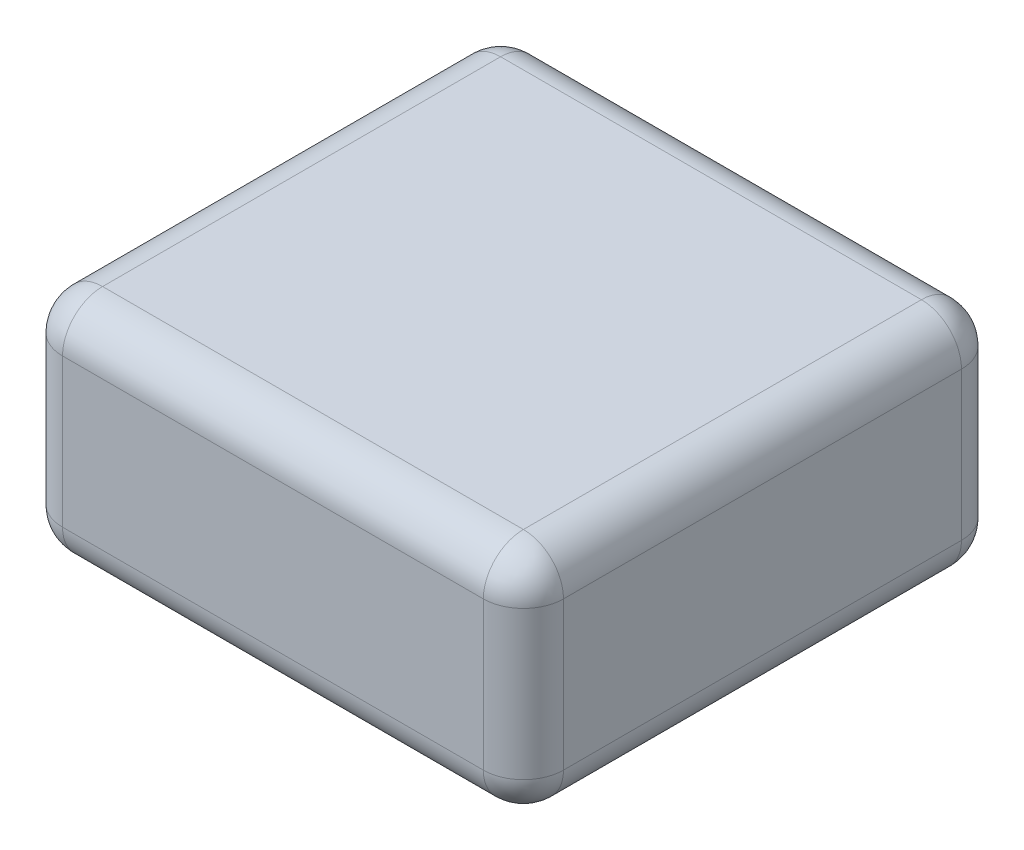
ISO-10303-21;
HEADER;
FILE_DESCRIPTION(('STEP AP214'),'2;1');
FILE_NAME('part.step','',(''),(''),'','','');
FILE_SCHEMA(('AUTOMOTIVE_DESIGN { 1 0 10303 214 1 1 1 1 }'));
ENDSEC;
DATA;
#1=APPLICATION_CONTEXT('core data for automotive mechanical design processes');
#2=APPLICATION_PROTOCOL_DEFINITION('international standard','automotive_design',2000,#1);
#3=PRODUCT_CONTEXT('',#1,'mechanical');
#4=PRODUCT('Part','Part','',(#3));
#5=PRODUCT_RELATED_PRODUCT_CATEGORY('part','',(#4));
#6=PRODUCT_DEFINITION_FORMATION('','',#4);
#7=PRODUCT_DEFINITION_CONTEXT('part definition',#1,'design');
#8=PRODUCT_DEFINITION('design','',#6,#7);
#9=PRODUCT_DEFINITION_SHAPE('','',#8);
#10=(LENGTH_UNIT() NAMED_UNIT(*) SI_UNIT(.MILLI.,.METRE.));
#11=(NAMED_UNIT(*) PLANE_ANGLE_UNIT() SI_UNIT($,.RADIAN.));
#12=(NAMED_UNIT(*) SI_UNIT($,.STERADIAN.) SOLID_ANGLE_UNIT());
#13=UNCERTAINTY_MEASURE_WITH_UNIT(LENGTH_MEASURE(1.E-05),#10,'distance_accuracy_value','');
#14=(GEOMETRIC_REPRESENTATION_CONTEXT(3) GLOBAL_UNCERTAINTY_ASSIGNED_CONTEXT((#13)) GLOBAL_UNIT_ASSIGNED_CONTEXT((#10,
#11,#12)) REPRESENTATION_CONTEXT('',''));
#15=CARTESIAN_POINT('',(0.,0.,0.));
#16=DIRECTION('',(0.,0.,1.));
#17=DIRECTION('',(1.,0.,0.));
#18=AXIS2_PLACEMENT_3D('',#15,#16,#17);
#19=CARTESIAN_POINT('',(10.5,-36.3,100.931));
#20=DIRECTION('',(0.,-1.,0.));
#21=DIRECTION('',(1.,0.,0.));
#22=AXIS2_PLACEMENT_3D('',#19,#20,#21);
#23=SPHERICAL_SURFACE('',#22,2.);
#24=CARTESIAN_POINT('',(10.5,-36.3,100.931));
#25=DIRECTION('',(0.,0.,-1.));
#26=DIRECTION('',(1.,0.,0.));
#27=AXIS2_PLACEMENT_3D('',#24,#25,#26);
#28=CIRCLE('',#27,2.);
#29=CARTESIAN_POINT('',(10.5,-34.3,100.931));
#30=VERTEX_POINT('',#29);
#31=CARTESIAN_POINT('',(12.5,-36.3,100.931));
#32=VERTEX_POINT('',#31);
#33=EDGE_CURVE('E10',#30,#32,#28,.T.);
#34=ORIENTED_EDGE('',*,*,#33,.F.);
#35=CARTESIAN_POINT('',(10.5,-36.3,100.931));
#36=DIRECTION('',(1.,0.,0.));
#37=DIRECTION('',(0.,0.,1.));
#38=AXIS2_PLACEMENT_3D('',#35,#36,#37);
#39=CIRCLE('',#38,2.);
#40=CARTESIAN_POINT('',(10.5,-36.3,102.931));
#41=VERTEX_POINT('',#40);
#42=EDGE_CURVE('E129',#30,#41,#39,.T.);
#43=ORIENTED_EDGE('',*,*,#42,.T.);
#44=CARTESIAN_POINT('',(10.5,-36.3,100.931));
#45=DIRECTION('',(0.,-1.,0.));
#46=DIRECTION('',(1.,0.,0.));
#47=AXIS2_PLACEMENT_3D('',#44,#45,#46);
#48=CIRCLE('',#47,2.);
#49=EDGE_CURVE('E118',#32,#41,#48,.T.);
#50=ORIENTED_EDGE('',*,*,#49,.F.);
#51=EDGE_LOOP('',(#34,#43,#50));
#52=FACE_BOUND('',#51,.T.);
#53=ADVANCED_FACE('F16',(#52),#23,.T.);
#54=CARTESIAN_POINT('',(10.5,-36.3,81.069));
#55=DIRECTION('',(0.,0.,1.));
#56=DIRECTION('',(1.,0.,0.));
#57=AXIS2_PLACEMENT_3D('',#54,#55,#56);
#58=SPHERICAL_SURFACE('',#57,2.);
#59=CARTESIAN_POINT('',(10.5,-36.3,81.069));
#60=DIRECTION('',(0.,-1.,0.));
#61=DIRECTION('',(1.,0.,0.));
#62=AXIS2_PLACEMENT_3D('',#59,#60,#61);
#63=CIRCLE('',#62,2.);
#64=CARTESIAN_POINT('',(10.5,-36.3,79.069));
#65=VERTEX_POINT('',#64);
#66=CARTESIAN_POINT('',(12.5,-36.3,81.069));
#67=VERTEX_POINT('',#66);
#68=EDGE_CURVE('E200',#65,#67,#63,.T.);
#69=ORIENTED_EDGE('',*,*,#68,.F.);
#70=CARTESIAN_POINT('',(10.5,-36.3,81.069));
#71=DIRECTION('',(1.,0.,0.));
#72=DIRECTION('',(0.,1.,0.));
#73=AXIS2_PLACEMENT_3D('',#70,#71,#72);
#74=CIRCLE('',#73,2.);
#75=CARTESIAN_POINT('',(10.5,-34.3,81.069));
#76=VERTEX_POINT('',#75);
#77=EDGE_CURVE('E137',#65,#76,#74,.T.);
#78=ORIENTED_EDGE('',*,*,#77,.T.);
#79=CARTESIAN_POINT('',(10.5,-36.3,81.069));
#80=DIRECTION('',(0.,0.,1.));
#81=DIRECTION('',(1.,0.,0.));
#82=AXIS2_PLACEMENT_3D('',#79,#80,#81);
#83=CIRCLE('',#82,2.);
#84=EDGE_CURVE('E24',#67,#76,#83,.T.);
#85=ORIENTED_EDGE('',*,*,#84,.F.);
#86=EDGE_LOOP('',(#69,#78,#85));
#87=FACE_BOUND('',#86,.T.);
#88=ADVANCED_FACE('F217',(#87),#58,.T.);
#89=CARTESIAN_POINT('',(12.5,-45.7,79.069));
#90=DIRECTION('',(1.,0.,0.));
#91=DIRECTION('',(0.,1.,0.));
#92=AXIS2_PLACEMENT_3D('',#89,#90,#91);
#93=PLANE('',#92);
#94=DIRECTION('',(0.,0.,1.));
#95=VECTOR('',#94,1.);
#96=CARTESIAN_POINT('',(12.5,-43.7,79.069));
#97=LINE('',#96,#95);
#98=CARTESIAN_POINT('',(12.5,-43.7,81.069));
#99=VERTEX_POINT('',#98);
#100=CARTESIAN_POINT('',(12.5,-43.7,100.931));
#101=VERTEX_POINT('',#100);
#102=EDGE_CURVE('E125',#99,#101,#97,.T.);
#103=ORIENTED_EDGE('',*,*,#102,.F.);
#104=DIRECTION('',(0.,1.,0.));
#105=VECTOR('',#104,1.);
#106=CARTESIAN_POINT('',(12.5,-45.7,81.069));
#107=LINE('',#106,#105);
#108=EDGE_CURVE('E204',#99,#67,#107,.T.);
#109=ORIENTED_EDGE('',*,*,#108,.T.);
#110=DIRECTION('',(0.,0.,1.));
#111=VECTOR('',#110,1.);
#112=CARTESIAN_POINT('',(12.5,-36.3,79.069));
#113=LINE('',#112,#111);
#114=EDGE_CURVE('E117',#67,#32,#113,.T.);
#115=ORIENTED_EDGE('',*,*,#114,.T.);
#116=DIRECTION('',(0.,1.,0.));
#117=VECTOR('',#116,1.);
#118=CARTESIAN_POINT('',(12.5,-45.7,100.931));
#119=LINE('',#118,#117);
#120=EDGE_CURVE('E108',#101,#32,#119,.T.);
#121=ORIENTED_EDGE('',*,*,#120,.F.);
#122=EDGE_LOOP('',(#103,#109,#115,#121));
#123=FACE_BOUND('',#122,.T.);
#124=ADVANCED_FACE('F123',(#123),#93,.T.);
#125=CARTESIAN_POINT('',(10.5,-43.7,100.931));
#126=DIRECTION('',(0.,0.,-1.));
#127=DIRECTION('',(1.,0.,0.));
#128=AXIS2_PLACEMENT_3D('',#125,#126,#127);
#129=SPHERICAL_SURFACE('',#128,2.);
#130=CARTESIAN_POINT('',(10.5,-43.7,100.931));
#131=DIRECTION('',(0.,1.,0.));
#132=DIRECTION('',(1.,0.,0.));
#133=AXIS2_PLACEMENT_3D('',#130,#131,#132);
#134=CIRCLE('',#133,2.);
#135=CARTESIAN_POINT('',(10.5,-43.7,102.931));
#136=VERTEX_POINT('',#135);
#137=EDGE_CURVE('E105',#136,#101,#134,.T.);
#138=ORIENTED_EDGE('',*,*,#137,.F.);
#139=CARTESIAN_POINT('',(10.5,-43.7,100.931));
#140=DIRECTION('',(1.,0.,0.));
#141=DIRECTION('',(0.,-1.,0.));
#142=AXIS2_PLACEMENT_3D('',#139,#140,#141);
#143=CIRCLE('',#142,2.);
#144=CARTESIAN_POINT('',(10.5,-45.7,100.931));
#145=VERTEX_POINT('',#144);
#146=EDGE_CURVE('E140',#136,#145,#143,.T.);
#147=ORIENTED_EDGE('',*,*,#146,.T.);
#148=CARTESIAN_POINT('',(10.5,-43.7,100.931));
#149=DIRECTION('',(0.,0.,-1.));
#150=DIRECTION('',(1.,0.,0.));
#151=AXIS2_PLACEMENT_3D('',#148,#149,#150);
#152=CIRCLE('',#151,2.);
#153=EDGE_CURVE('E134',#101,#145,#152,.T.);
#154=ORIENTED_EDGE('',*,*,#153,.F.);
#155=EDGE_LOOP('',(#138,#147,#154));
#156=FACE_BOUND('',#155,.T.);
#157=ADVANCED_FACE('F139',(#156),#129,.T.);
#158=CARTESIAN_POINT('',(10.5,-43.7,81.069));
#159=DIRECTION('',(0.,0.,1.));
#160=DIRECTION('',(1.,0.,0.));
#161=AXIS2_PLACEMENT_3D('',#158,#159,#160);
#162=SPHERICAL_SURFACE('',#161,2.);
#163=CARTESIAN_POINT('',(10.5,-43.7,81.069));
#164=DIRECTION('',(0.,0.,-1.));
#165=DIRECTION('',(1.,0.,0.));
#166=AXIS2_PLACEMENT_3D('',#163,#164,#165);
#167=CIRCLE('',#166,2.);
#168=CARTESIAN_POINT('',(10.5,-45.7,81.069));
#169=VERTEX_POINT('',#168);
#170=EDGE_CURVE('E135',#99,#169,#167,.T.);
#171=ORIENTED_EDGE('',*,*,#170,.T.);
#172=CARTESIAN_POINT('',(10.5,-43.7,81.069));
#173=DIRECTION('',(-1.,0.,0.));
#174=DIRECTION('',(0.,-1.,0.));
#175=AXIS2_PLACEMENT_3D('',#172,#173,#174);
#176=CIRCLE('',#175,2.);
#177=CARTESIAN_POINT('',(10.5,-43.7,79.069));
#178=VERTEX_POINT('',#177);
#179=EDGE_CURVE('E150',#178,#169,#176,.T.);
#180=ORIENTED_EDGE('',*,*,#179,.F.);
#181=CARTESIAN_POINT('',(10.5,-43.7,81.069));
#182=DIRECTION('',(0.,-1.,0.));
#183=DIRECTION('',(1.,0.,0.));
#184=AXIS2_PLACEMENT_3D('',#181,#182,#183);
#185=CIRCLE('',#184,2.);
#186=EDGE_CURVE('E190',#178,#99,#185,.T.);
#187=ORIENTED_EDGE('',*,*,#186,.T.);
#188=EDGE_LOOP('',(#171,#180,#187));
#189=FACE_BOUND('',#188,.T.);
#190=ADVANCED_FACE('F602',(#189),#162,.T.);
#191=CARTESIAN_POINT('',(10.5,-36.3,79.069));
#192=DIRECTION('',(0.,0.,1.));
#193=DIRECTION('',(1.,0.,0.));
#194=AXIS2_PLACEMENT_3D('',#191,#192,#193);
#195=CYLINDRICAL_SURFACE('',#194,2.);
#196=ORIENTED_EDGE('',*,*,#114,.F.);
#197=ORIENTED_EDGE('',*,*,#84,.T.);
#198=DIRECTION('',(0.,0.,1.));
#199=VECTOR('',#198,1.);
#200=CARTESIAN_POINT('',(10.5,-34.3,79.069));
#201=LINE('',#200,#199);
#202=EDGE_CURVE('E184',#76,#30,#201,.T.);
#203=ORIENTED_EDGE('',*,*,#202,.T.);
#204=ORIENTED_EDGE('',*,*,#33,.T.);
#205=EDGE_LOOP('',(#196,#197,#203,#204));
#206=FACE_BOUND('',#205,.T.);
#207=ADVANCED_FACE('F214',(#206),#195,.T.);
#208=CARTESIAN_POINT('',(10.5,-45.7,100.931));
#209=DIRECTION('',(0.,1.,0.));
#210=DIRECTION('',(1.,0.,0.));
#211=AXIS2_PLACEMENT_3D('',#208,#209,#210);
#212=CYLINDRICAL_SURFACE('',#211,2.);
#213=ORIENTED_EDGE('',*,*,#120,.T.);
#214=ORIENTED_EDGE('',*,*,#49,.T.);
#215=DIRECTION('',(0.,1.,0.));
#216=VECTOR('',#215,1.);
#217=CARTESIAN_POINT('',(10.5,-45.7,102.931));
#218=LINE('',#217,#216);
#219=EDGE_CURVE('E110',#136,#41,#218,.T.);
#220=ORIENTED_EDGE('',*,*,#219,.F.);
#221=ORIENTED_EDGE('',*,*,#137,.T.);
#222=EDGE_LOOP('',(#213,#214,#220,#221));
#223=FACE_BOUND('',#222,.T.);
#224=ADVANCED_FACE('F107',(#223),#212,.T.);
#225=CARTESIAN_POINT('',(-12.5,-36.3,100.931));
#226=DIRECTION('',(1.,0.,0.));
#227=DIRECTION('',(0.,1.,0.));
#228=AXIS2_PLACEMENT_3D('',#225,#226,#227);
#229=CYLINDRICAL_SURFACE('',#228,2.);
#230=CARTESIAN_POINT('',(-10.5,-36.3,100.931));
#231=DIRECTION('',(1.,0.,0.));
#232=DIRECTION('',(0.,0.,1.));
#233=AXIS2_PLACEMENT_3D('',#230,#231,#232);
#234=CIRCLE('',#233,2.);
#235=CARTESIAN_POINT('',(-10.5,-34.3,100.931));
#236=VERTEX_POINT('',#235);
#237=CARTESIAN_POINT('',(-10.5,-36.3,102.931));
#238=VERTEX_POINT('',#237);
#239=EDGE_CURVE('E177',#236,#238,#234,.T.);
#240=ORIENTED_EDGE('',*,*,#239,.T.);
#241=DIRECTION('',(1.,0.,0.));
#242=VECTOR('',#241,1.);
#243=CARTESIAN_POINT('',(-12.5,-36.3,102.931));
#244=LINE('',#243,#242);
#245=EDGE_CURVE('E167',#238,#41,#244,.T.);
#246=ORIENTED_EDGE('',*,*,#245,.T.);
#247=ORIENTED_EDGE('',*,*,#42,.F.);
#248=DIRECTION('',(1.,0.,0.));
#249=VECTOR('',#248,1.);
#250=CARTESIAN_POINT('',(-12.5,-34.3,100.931));
#251=LINE('',#250,#249);
#252=EDGE_CURVE('E180',#236,#30,#251,.T.);
#253=ORIENTED_EDGE('',*,*,#252,.F.);
#254=EDGE_LOOP('',(#240,#246,#247,#253));
#255=FACE_BOUND('',#254,.T.);
#256=ADVANCED_FACE('F232',(#255),#229,.T.);
#257=CARTESIAN_POINT('',(10.5,-45.7,81.069));
#258=DIRECTION('',(0.,1.,0.));
#259=DIRECTION('',(1.,0.,0.));
#260=AXIS2_PLACEMENT_3D('',#257,#258,#259);
#261=CYLINDRICAL_SURFACE('',#260,2.);
#262=ORIENTED_EDGE('',*,*,#186,.F.);
#263=DIRECTION('',(0.,1.,0.));
#264=VECTOR('',#263,1.);
#265=CARTESIAN_POINT('',(10.5,-45.7,79.069));
#266=LINE('',#265,#264);
#267=EDGE_CURVE('E156',#178,#65,#266,.T.);
#268=ORIENTED_EDGE('',*,*,#267,.T.);
#269=ORIENTED_EDGE('',*,*,#68,.T.);
#270=ORIENTED_EDGE('',*,*,#108,.F.);
#271=EDGE_LOOP('',(#262,#268,#269,#270));
#272=FACE_BOUND('',#271,.T.);
#273=ADVANCED_FACE('F658',(#272),#261,.T.);
#274=CARTESIAN_POINT('',(-12.5,-36.3,81.069));
#275=DIRECTION('',(1.,0.,0.));
#276=DIRECTION('',(0.,1.,0.));
#277=AXIS2_PLACEMENT_3D('',#274,#275,#276);
#278=CYLINDRICAL_SURFACE('',#277,2.);
#279=DIRECTION('',(1.,0.,0.));
#280=VECTOR('',#279,1.);
#281=CARTESIAN_POINT('',(-12.5,-34.3,81.069));
#282=LINE('',#281,#280);
#283=CARTESIAN_POINT('',(-10.5,-34.3,81.069));
#284=VERTEX_POINT('',#283);
#285=EDGE_CURVE('E187',#284,#76,#282,.T.);
#286=ORIENTED_EDGE('',*,*,#285,.T.);
#287=ORIENTED_EDGE('',*,*,#77,.F.);
#288=DIRECTION('',(1.,0.,0.));
#289=VECTOR('',#288,1.);
#290=CARTESIAN_POINT('',(-12.5,-36.3,79.069));
#291=LINE('',#290,#289);
#292=CARTESIAN_POINT('',(-10.5,-36.3,79.069));
#293=VERTEX_POINT('',#292);
#294=EDGE_CURVE('E154',#293,#65,#291,.T.);
#295=ORIENTED_EDGE('',*,*,#294,.F.);
#296=CARTESIAN_POINT('',(-10.5,-36.3,81.069));
#297=DIRECTION('',(1.,0.,0.));
#298=DIRECTION('',(0.,1.,0.));
#299=AXIS2_PLACEMENT_3D('',#296,#297,#298);
#300=CIRCLE('',#299,2.);
#301=EDGE_CURVE('E164',#293,#284,#300,.T.);
#302=ORIENTED_EDGE('',*,*,#301,.T.);
#303=EDGE_LOOP('',(#286,#287,#295,#302));
#304=FACE_BOUND('',#303,.T.);
#305=ADVANCED_FACE('F220',(#304),#278,.T.);
#306=CARTESIAN_POINT('',(10.5,-43.7,79.069));
#307=DIRECTION('',(0.,0.,1.));
#308=DIRECTION('',(1.,0.,0.));
#309=AXIS2_PLACEMENT_3D('',#306,#307,#308);
#310=CYLINDRICAL_SURFACE('',#309,2.);
#311=ORIENTED_EDGE('',*,*,#153,.T.);
#312=DIRECTION('',(0.,0.,1.));
#313=VECTOR('',#312,1.);
#314=CARTESIAN_POINT('',(10.5,-45.7,79.069));
#315=LINE('',#314,#313);
#316=EDGE_CURVE('E281',#169,#145,#315,.T.);
#317=ORIENTED_EDGE('',*,*,#316,.F.);
#318=ORIENTED_EDGE('',*,*,#170,.F.);
#319=ORIENTED_EDGE('',*,*,#102,.T.);
#320=EDGE_LOOP('',(#311,#317,#318,#319));
#321=FACE_BOUND('',#320,.T.);
#322=ADVANCED_FACE('F132',(#321),#310,.T.);
#323=CARTESIAN_POINT('',(-12.5,-43.7,100.931));
#324=DIRECTION('',(1.,0.,0.));
#325=DIRECTION('',(0.,-1.,0.));
#326=AXIS2_PLACEMENT_3D('',#323,#324,#325);
#327=CYLINDRICAL_SURFACE('',#326,2.);
#328=DIRECTION('',(1.,0.,0.));
#329=VECTOR('',#328,1.);
#330=CARTESIAN_POINT('',(-12.5,-45.7,100.931));
#331=LINE('',#330,#329);
#332=CARTESIAN_POINT('',(-10.5,-45.7,100.931));
#333=VERTEX_POINT('',#332);
#334=EDGE_CURVE('E284',#333,#145,#331,.T.);
#335=ORIENTED_EDGE('',*,*,#334,.T.);
#336=ORIENTED_EDGE('',*,*,#146,.F.);
#337=DIRECTION('',(1.,0.,0.));
#338=VECTOR('',#337,1.);
#339=CARTESIAN_POINT('',(-12.5,-43.7,102.931));
#340=LINE('',#339,#338);
#341=CARTESIAN_POINT('',(-10.5,-43.7,102.931));
#342=VERTEX_POINT('',#341);
#343=EDGE_CURVE('E168',#342,#136,#340,.T.);
#344=ORIENTED_EDGE('',*,*,#343,.F.);
#345=CARTESIAN_POINT('',(-10.5,-43.7,100.931));
#346=DIRECTION('',(1.,0.,0.));
#347=DIRECTION('',(0.,-1.,0.));
#348=AXIS2_PLACEMENT_3D('',#345,#346,#347);
#349=CIRCLE('',#348,2.);
#350=EDGE_CURVE('E273',#342,#333,#349,.T.);
#351=ORIENTED_EDGE('',*,*,#350,.T.);
#352=EDGE_LOOP('',(#335,#336,#344,#351));
#353=FACE_BOUND('',#352,.T.);
#354=ADVANCED_FACE('F380',(#353),#327,.T.);
#355=CARTESIAN_POINT('',(-12.5,-43.7,81.069));
#356=DIRECTION('',(1.,0.,0.));
#357=DIRECTION('',(0.,-1.,0.));
#358=AXIS2_PLACEMENT_3D('',#355,#356,#357);
#359=CYLINDRICAL_SURFACE('',#358,2.);
#360=CARTESIAN_POINT('',(-10.5,-43.7,81.069));
#361=DIRECTION('',(-1.,0.,0.));
#362=DIRECTION('',(0.,-1.,0.));
#363=AXIS2_PLACEMENT_3D('',#360,#361,#362);
#364=CIRCLE('',#363,2.);
#365=CARTESIAN_POINT('',(-10.5,-43.7,79.069));
#366=VERTEX_POINT('',#365);
#367=CARTESIAN_POINT('',(-10.5,-45.7,81.069));
#368=VERTEX_POINT('',#367);
#369=EDGE_CURVE('E266',#366,#368,#364,.T.);
#370=ORIENTED_EDGE('',*,*,#369,.F.);
#371=DIRECTION('',(1.,0.,0.));
#372=VECTOR('',#371,1.);
#373=CARTESIAN_POINT('',(-12.5,-43.7,79.069));
#374=LINE('',#373,#372);
#375=EDGE_CURVE('E160',#366,#178,#374,.T.);
#376=ORIENTED_EDGE('',*,*,#375,.T.);
#377=ORIENTED_EDGE('',*,*,#179,.T.);
#378=DIRECTION('',(1.,0.,0.));
#379=VECTOR('',#378,1.);
#380=CARTESIAN_POINT('',(-12.5,-45.7,81.069));
#381=LINE('',#380,#379);
#382=EDGE_CURVE('E277',#368,#169,#381,.T.);
#383=ORIENTED_EDGE('',*,*,#382,.F.);
#384=EDGE_LOOP('',(#370,#376,#377,#383));
#385=FACE_BOUND('',#384,.T.);
#386=ADVANCED_FACE('F392',(#385),#359,.T.);
#387=CARTESIAN_POINT('',(-12.5,-34.3,79.069));
#388=DIRECTION('',(0.,1.,0.));
#389=DIRECTION('',(1.,0.,0.));
#390=AXIS2_PLACEMENT_3D('',#387,#388,#389);
#391=PLANE('',#390);
#392=DIRECTION('',(0.,0.,1.));
#393=VECTOR('',#392,1.);
#394=CARTESIAN_POINT('',(-10.5,-34.3,79.069));
#395=LINE('',#394,#393);
#396=EDGE_CURVE('E227',#284,#236,#395,.T.);
#397=ORIENTED_EDGE('',*,*,#396,.T.);
#398=ORIENTED_EDGE('',*,*,#252,.T.);
#399=ORIENTED_EDGE('',*,*,#202,.F.);
#400=ORIENTED_EDGE('',*,*,#285,.F.);
#401=EDGE_LOOP('',(#397,#398,#399,#400));
#402=FACE_BOUND('',#401,.T.);
#403=ADVANCED_FACE('F225',(#402),#391,.T.);
#404=CARTESIAN_POINT('',(-10.5,-36.3,100.931));
#405=DIRECTION('',(0.,-1.,0.));
#406=DIRECTION('',(-1.,0.,0.));
#407=AXIS2_PLACEMENT_3D('',#404,#405,#406);
#408=SPHERICAL_SURFACE('',#407,2.);
#409=CARTESIAN_POINT('',(-10.5,-36.3,100.931));
#410=DIRECTION('',(0.,1.,0.));
#411=DIRECTION('',(-1.,0.,0.));
#412=AXIS2_PLACEMENT_3D('',#409,#410,#411);
#413=CIRCLE('',#412,2.);
#414=CARTESIAN_POINT('',(-12.5,-36.3,100.931));
#415=VERTEX_POINT('',#414);
#416=EDGE_CURVE('E241',#415,#238,#413,.T.);
#417=ORIENTED_EDGE('',*,*,#416,.T.);
#418=ORIENTED_EDGE('',*,*,#239,.F.);
#419=CARTESIAN_POINT('',(-10.5,-36.3,100.931));
#420=DIRECTION('',(0.,0.,1.));
#421=DIRECTION('',(-1.,0.,0.));
#422=AXIS2_PLACEMENT_3D('',#419,#420,#421);
#423=CIRCLE('',#422,2.);
#424=EDGE_CURVE('E239',#236,#415,#423,.T.);
#425=ORIENTED_EDGE('',*,*,#424,.T.);
#426=EDGE_LOOP('',(#417,#418,#425));
#427=FACE_BOUND('',#426,.T.);
#428=ADVANCED_FACE('F237',(#427),#408,.T.);
#429=CARTESIAN_POINT('',(-12.5,-45.7,102.931));
#430=DIRECTION('',(0.,0.,1.));
#431=DIRECTION('',(1.,0.,0.));
#432=AXIS2_PLACEMENT_3D('',#429,#430,#431);
#433=PLANE('',#432);
#434=DIRECTION('',(0.,1.,0.));
#435=VECTOR('',#434,1.);
#436=CARTESIAN_POINT('',(-10.5,-45.7,102.931));
#437=LINE('',#436,#435);
#438=EDGE_CURVE('E247',#342,#238,#437,.T.);
#439=ORIENTED_EDGE('',*,*,#438,.F.);
#440=ORIENTED_EDGE('',*,*,#343,.T.);
#441=ORIENTED_EDGE('',*,*,#219,.T.);
#442=ORIENTED_EDGE('',*,*,#245,.F.);
#443=EDGE_LOOP('',(#439,#440,#441,#442));
#444=FACE_BOUND('',#443,.T.);
#445=ADVANCED_FACE('F378',(#444),#433,.T.);
#446=CARTESIAN_POINT('',(-10.5,-36.3,81.069));
#447=DIRECTION('',(0.,0.,1.));
#448=DIRECTION('',(-1.,0.,0.));
#449=AXIS2_PLACEMENT_3D('',#446,#447,#448);
#450=SPHERICAL_SURFACE('',#449,2.);
#451=CARTESIAN_POINT('',(-10.5,-36.3,81.069));
#452=DIRECTION('',(0.,0.,-1.));
#453=DIRECTION('',(-1.,0.,0.));
#454=AXIS2_PLACEMENT_3D('',#451,#452,#453);
#455=CIRCLE('',#454,2.);
#456=CARTESIAN_POINT('',(-12.5,-36.3,81.069));
#457=VERTEX_POINT('',#456);
#458=EDGE_CURVE('E264',#457,#284,#455,.T.);
#459=ORIENTED_EDGE('',*,*,#458,.T.);
#460=ORIENTED_EDGE('',*,*,#301,.F.);
#461=CARTESIAN_POINT('',(-10.5,-36.3,81.069));
#462=DIRECTION('',(0.,1.,0.));
#463=DIRECTION('',(-1.,0.,0.));
#464=AXIS2_PLACEMENT_3D('',#461,#462,#463);
#465=CIRCLE('',#464,2.);
#466=EDGE_CURVE('E332',#293,#457,#465,.T.);
#467=ORIENTED_EDGE('',*,*,#466,.T.);
#468=EDGE_LOOP('',(#459,#460,#467));
#469=FACE_BOUND('',#468,.T.);
#470=ADVANCED_FACE('F334',(#469),#450,.T.);
#471=CARTESIAN_POINT('',(-12.5,-45.7,79.069));
#472=DIRECTION('',(0.,0.,1.));
#473=DIRECTION('',(1.,0.,0.));
#474=AXIS2_PLACEMENT_3D('',#471,#472,#473);
#475=PLANE('',#474);
#476=ORIENTED_EDGE('',*,*,#294,.T.);
#477=ORIENTED_EDGE('',*,*,#267,.F.);
#478=ORIENTED_EDGE('',*,*,#375,.F.);
#479=DIRECTION('',(0.,1.,0.));
#480=VECTOR('',#479,1.);
#481=CARTESIAN_POINT('',(-10.5,-45.7,79.069));
#482=LINE('',#481,#480);
#483=EDGE_CURVE('E301',#366,#293,#482,.T.);
#484=ORIENTED_EDGE('',*,*,#483,.T.);
#485=EDGE_LOOP('',(#476,#477,#478,#484));
#486=FACE_BOUND('',#485,.T.);
#487=ADVANCED_FACE('F297',(#486),#475,.F.);
#488=CARTESIAN_POINT('',(-12.5,-45.7,79.069));
#489=DIRECTION('',(0.,1.,0.));
#490=DIRECTION('',(1.,0.,0.));
#491=AXIS2_PLACEMENT_3D('',#488,#489,#490);
#492=PLANE('',#491);
#493=ORIENTED_EDGE('',*,*,#382,.T.);
#494=ORIENTED_EDGE('',*,*,#316,.T.);
#495=ORIENTED_EDGE('',*,*,#334,.F.);
#496=DIRECTION('',(0.,0.,1.));
#497=VECTOR('',#496,1.);
#498=CARTESIAN_POINT('',(-10.5,-45.7,79.069));
#499=LINE('',#498,#497);
#500=EDGE_CURVE('E365',#368,#333,#499,.T.);
#501=ORIENTED_EDGE('',*,*,#500,.F.);
#502=EDGE_LOOP('',(#493,#494,#495,#501));
#503=FACE_BOUND('',#502,.T.);
#504=ADVANCED_FACE('F389',(#503),#492,.F.);
#505=CARTESIAN_POINT('',(-10.5,-43.7,100.931));
#506=DIRECTION('',(0.,0.,-1.));
#507=DIRECTION('',(-1.,0.,0.));
#508=AXIS2_PLACEMENT_3D('',#505,#506,#507);
#509=SPHERICAL_SURFACE('',#508,2.);
#510=CARTESIAN_POINT('',(-10.5,-43.7,100.931));
#511=DIRECTION('',(0.,0.,1.));
#512=DIRECTION('',(-1.,0.,0.));
#513=AXIS2_PLACEMENT_3D('',#510,#511,#512);
#514=CIRCLE('',#513,2.);
#515=CARTESIAN_POINT('',(-12.5,-43.7,100.931));
#516=VERTEX_POINT('',#515);
#517=EDGE_CURVE('E337',#516,#333,#514,.T.);
#518=ORIENTED_EDGE('',*,*,#517,.T.);
#519=ORIENTED_EDGE('',*,*,#350,.F.);
#520=CARTESIAN_POINT('',(-10.5,-43.7,100.931));
#521=DIRECTION('',(0.,-1.,0.));
#522=DIRECTION('',(-1.,0.,0.));
#523=AXIS2_PLACEMENT_3D('',#520,#521,#522);
#524=CIRCLE('',#523,2.);
#525=EDGE_CURVE('E253',#342,#516,#524,.T.);
#526=ORIENTED_EDGE('',*,*,#525,.T.);
#527=EDGE_LOOP('',(#518,#519,#526));
#528=FACE_BOUND('',#527,.T.);
#529=ADVANCED_FACE('F382',(#528),#509,.T.);
#530=CARTESIAN_POINT('',(-10.5,-43.7,81.069));
#531=DIRECTION('',(0.,0.,1.));
#532=DIRECTION('',(-1.,0.,0.));
#533=AXIS2_PLACEMENT_3D('',#530,#531,#532);
#534=SPHERICAL_SURFACE('',#533,2.);
#535=CARTESIAN_POINT('',(-10.5,-43.7,81.069));
#536=DIRECTION('',(0.,1.,0.));
#537=DIRECTION('',(-1.,0.,0.));
#538=AXIS2_PLACEMENT_3D('',#535,#536,#537);
#539=CIRCLE('',#538,2.);
#540=CARTESIAN_POINT('',(-12.5,-43.7,81.069));
#541=VERTEX_POINT('',#540);
#542=EDGE_CURVE('E260',#366,#541,#539,.T.);
#543=ORIENTED_EDGE('',*,*,#542,.F.);
#544=ORIENTED_EDGE('',*,*,#369,.T.);
#545=CARTESIAN_POINT('',(-10.5,-43.7,81.069));
#546=DIRECTION('',(0.,0.,1.));
#547=DIRECTION('',(-1.,0.,0.));
#548=AXIS2_PLACEMENT_3D('',#545,#546,#547);
#549=CIRCLE('',#548,2.);
#550=EDGE_CURVE('E361',#541,#368,#549,.T.);
#551=ORIENTED_EDGE('',*,*,#550,.F.);
#552=EDGE_LOOP('',(#543,#544,#551));
#553=FACE_BOUND('',#552,.T.);
#554=ADVANCED_FACE('F395',(#553),#534,.T.);
#555=CARTESIAN_POINT('',(-10.5,-36.3,79.069));
#556=DIRECTION('',(0.,0.,1.));
#557=DIRECTION('',(-1.,0.,0.));
#558=AXIS2_PLACEMENT_3D('',#555,#556,#557);
#559=CYLINDRICAL_SURFACE('',#558,2.);
#560=ORIENTED_EDGE('',*,*,#424,.F.);
#561=ORIENTED_EDGE('',*,*,#396,.F.);
#562=ORIENTED_EDGE('',*,*,#458,.F.);
#563=DIRECTION('',(0.,0.,1.));
#564=VECTOR('',#563,1.);
#565=CARTESIAN_POINT('',(-12.5,-36.3,79.069));
#566=LINE('',#565,#564);
#567=EDGE_CURVE('E330',#457,#415,#566,.T.);
#568=ORIENTED_EDGE('',*,*,#567,.T.);
#569=EDGE_LOOP('',(#560,#561,#562,#568));
#570=FACE_BOUND('',#569,.T.);
#571=ADVANCED_FACE('F328',(#570),#559,.T.);
#572=CARTESIAN_POINT('',(-10.5,-45.7,100.931));
#573=DIRECTION('',(0.,1.,0.));
#574=DIRECTION('',(-1.,0.,0.));
#575=AXIS2_PLACEMENT_3D('',#572,#573,#574);
#576=CYLINDRICAL_SURFACE('',#575,2.);
#577=ORIENTED_EDGE('',*,*,#525,.F.);
#578=ORIENTED_EDGE('',*,*,#438,.T.);
#579=ORIENTED_EDGE('',*,*,#416,.F.);
#580=DIRECTION('',(0.,1.,0.));
#581=VECTOR('',#580,1.);
#582=CARTESIAN_POINT('',(-12.5,-45.7,100.931));
#583=LINE('',#582,#581);
#584=EDGE_CURVE('E350',#516,#415,#583,.T.);
#585=ORIENTED_EDGE('',*,*,#584,.F.);
#586=EDGE_LOOP('',(#577,#578,#579,#585));
#587=FACE_BOUND('',#586,.T.);
#588=ADVANCED_FACE('F251',(#587),#576,.T.);
#589=CARTESIAN_POINT('',(-10.5,-45.7,81.069));
#590=DIRECTION('',(0.,1.,0.));
#591=DIRECTION('',(-1.,0.,0.));
#592=AXIS2_PLACEMENT_3D('',#589,#590,#591);
#593=CYLINDRICAL_SURFACE('',#592,2.);
#594=DIRECTION('',(0.,1.,0.));
#595=VECTOR('',#594,1.);
#596=CARTESIAN_POINT('',(-12.5,-45.7,81.069));
#597=LINE('',#596,#595);
#598=EDGE_CURVE('E340',#541,#457,#597,.T.);
#599=ORIENTED_EDGE('',*,*,#598,.T.);
#600=ORIENTED_EDGE('',*,*,#466,.F.);
#601=ORIENTED_EDGE('',*,*,#483,.F.);
#602=ORIENTED_EDGE('',*,*,#542,.T.);
#603=EDGE_LOOP('',(#599,#600,#601,#602));
#604=FACE_BOUND('',#603,.T.);
#605=ADVANCED_FACE('F341',(#604),#593,.T.);
#606=CARTESIAN_POINT('',(-10.5,-43.7,79.069));
#607=DIRECTION('',(0.,0.,1.));
#608=DIRECTION('',(-1.,0.,0.));
#609=AXIS2_PLACEMENT_3D('',#606,#607,#608);
#610=CYLINDRICAL_SURFACE('',#609,2.);
#611=DIRECTION('',(0.,0.,1.));
#612=VECTOR('',#611,1.);
#613=CARTESIAN_POINT('',(-12.5,-43.7,79.069));
#614=LINE('',#613,#612);
#615=EDGE_CURVE('E347',#541,#516,#614,.T.);
#616=ORIENTED_EDGE('',*,*,#615,.F.);
#617=ORIENTED_EDGE('',*,*,#550,.T.);
#618=ORIENTED_EDGE('',*,*,#500,.T.);
#619=ORIENTED_EDGE('',*,*,#517,.F.);
#620=EDGE_LOOP('',(#616,#617,#618,#619));
#621=FACE_BOUND('',#620,.T.);
#622=ADVANCED_FACE('F387',(#621),#610,.T.);
#623=CARTESIAN_POINT('',(-12.5,-45.7,79.069));
#624=DIRECTION('',(1.,0.,0.));
#625=DIRECTION('',(0.,1.,0.));
#626=AXIS2_PLACEMENT_3D('',#623,#624,#625);
#627=PLANE('',#626);
#628=ORIENTED_EDGE('',*,*,#584,.T.);
#629=ORIENTED_EDGE('',*,*,#567,.F.);
#630=ORIENTED_EDGE('',*,*,#598,.F.);
#631=ORIENTED_EDGE('',*,*,#615,.T.);
#632=EDGE_LOOP('',(#628,#629,#630,#631));
#633=FACE_BOUND('',#632,.T.);
#634=ADVANCED_FACE('F349',(#633),#627,.F.);
#635=CLOSED_SHELL('',(#53,#88,#124,#157,#190,#207,#224,#256,#273,#305,#322,#354,#386,#403,#428,
#445,#470,#487,#504,#529,#554,#571,#588,#605,#622,#634));
#636=MANIFOLD_SOLID_BREP('B1',#635);
#637=ADVANCED_BREP_SHAPE_REPRESENTATION('',(#18,#636),#14);
#638=SHAPE_DEFINITION_REPRESENTATION(#9,#637);
ENDSEC;
END-ISO-10303-21;
